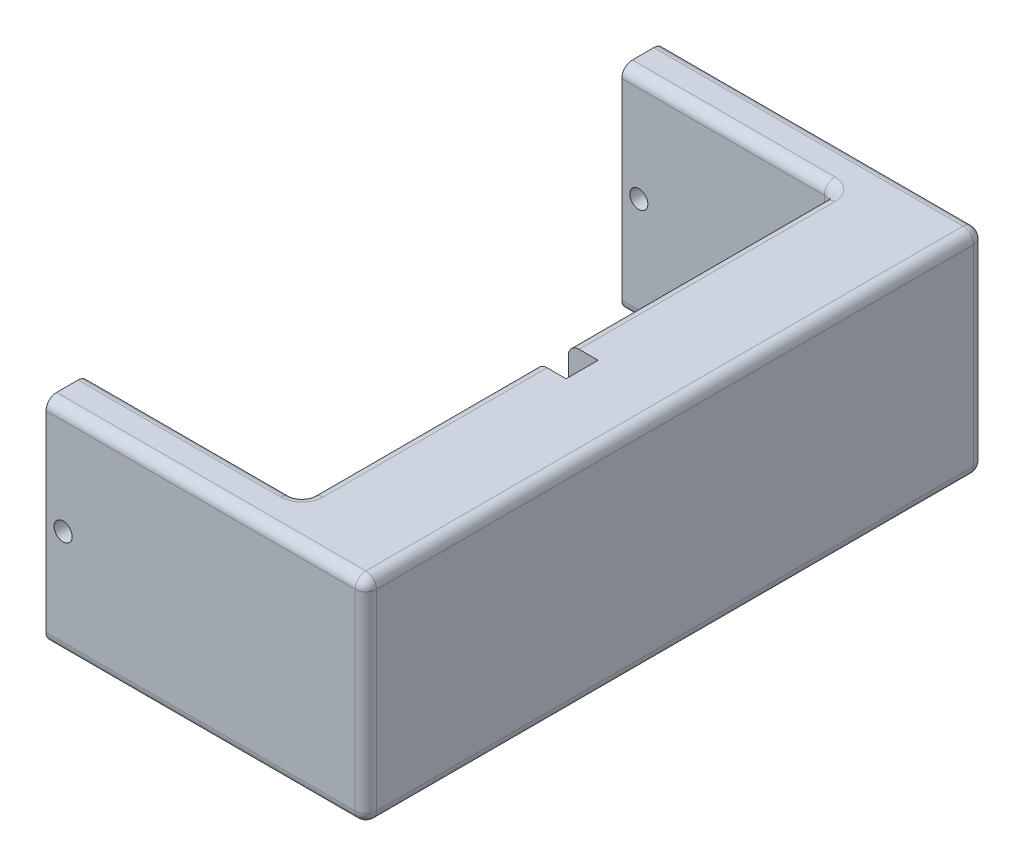
ISO-10303-21;
HEADER;
FILE_DESCRIPTION(('STEP AP214'),'2;1');
FILE_NAME('part.step','',(''),(''),'','','');
FILE_SCHEMA(('AUTOMOTIVE_DESIGN { 1 0 10303 214 1 1 1 1 }'));
ENDSEC;
DATA;
#1=APPLICATION_CONTEXT('core data for automotive mechanical design processes');
#2=APPLICATION_PROTOCOL_DEFINITION('international standard','automotive_design',2000,#1);
#3=PRODUCT_CONTEXT('',#1,'mechanical');
#4=PRODUCT('Part','Part','',(#3));
#5=PRODUCT_RELATED_PRODUCT_CATEGORY('part','',(#4));
#6=PRODUCT_DEFINITION_FORMATION('','',#4);
#7=PRODUCT_DEFINITION_CONTEXT('part definition',#1,'design');
#8=PRODUCT_DEFINITION('design','',#6,#7);
#9=PRODUCT_DEFINITION_SHAPE('','',#8);
#10=(LENGTH_UNIT() NAMED_UNIT(*) SI_UNIT(.MILLI.,.METRE.));
#11=(NAMED_UNIT(*) PLANE_ANGLE_UNIT() SI_UNIT($,.RADIAN.));
#12=(NAMED_UNIT(*) SI_UNIT($,.STERADIAN.) SOLID_ANGLE_UNIT());
#13=UNCERTAINTY_MEASURE_WITH_UNIT(LENGTH_MEASURE(1.E-05),#10,'distance_accuracy_value','');
#14=(GEOMETRIC_REPRESENTATION_CONTEXT(3) GLOBAL_UNCERTAINTY_ASSIGNED_CONTEXT((#13)) GLOBAL_UNIT_ASSIGNED_CONTEXT((#10,
#11,#12)) REPRESENTATION_CONTEXT('',''));
#15=CARTESIAN_POINT('',(0.,0.,0.));
#16=DIRECTION('',(0.,0.,1.));
#17=DIRECTION('',(1.,0.,0.));
#18=AXIS2_PLACEMENT_3D('',#15,#16,#17);
#19=CARTESIAN_POINT('',(1.05,0.95,0.));
#20=DIRECTION('',(0.,0.,-1.));
#21=DIRECTION('',(-1.,0.,0.));
#22=AXIS2_PLACEMENT_3D('',#19,#20,#21);
#23=CYLINDRICAL_SURFACE('',#22,0.05);
#24=CARTESIAN_POINT('',(1.05,0.95,0.00028488695492438));
#25=DIRECTION('',(0.,0.,-1.));
#26=DIRECTION('',(-1.,0.,0.));
#27=AXIS2_PLACEMENT_3D('',#24,#25,#26);
#28=CIRCLE('',#27,0.05);
#29=CARTESIAN_POINT('',(1.05,1.,0.00028488695492438));
#30=VERTEX_POINT('',#29);
#31=CARTESIAN_POINT('',(1.,0.95,0.000284886954924378));
#32=VERTEX_POINT('',#31);
#33=EDGE_CURVE('E54',#30,#32,#28,.F.);
#34=ORIENTED_EDGE('',*,*,#33,.F.);
#35=DIRECTION('',(0.,0.,1.));
#36=VECTOR('',#35,1.);
#37=CARTESIAN_POINT('',(1.05,1.,1.25));
#38=LINE('',#37,#36);
#39=CARTESIAN_POINT('',(1.05,1.,-1.2));
#40=VERTEX_POINT('',#39);
#41=EDGE_CURVE('E371',#40,#30,#38,.T.);
#42=ORIENTED_EDGE('',*,*,#41,.F.);
#43=CARTESIAN_POINT('',(1.05,0.95,-1.2));
#44=DIRECTION('',(0.,0.,-1.));
#45=DIRECTION('',(-1.,0.,0.));
#46=AXIS2_PLACEMENT_3D('',#43,#44,#45);
#47=CIRCLE('',#46,0.05);
#48=CARTESIAN_POINT('',(1.,0.95,-1.2));
#49=VERTEX_POINT('',#48);
#50=EDGE_CURVE('E495',#40,#49,#47,.F.);
#51=ORIENTED_EDGE('',*,*,#50,.T.);
#52=DIRECTION('',(0.,0.,1.));
#53=VECTOR('',#52,1.);
#54=CARTESIAN_POINT('',(1.,0.95,-1.25));
#55=LINE('',#54,#53);
#56=EDGE_CURVE('E435',#32,#49,#55,.F.);
#57=ORIENTED_EDGE('',*,*,#56,.F.);
#58=EDGE_LOOP('',(#34,#42,#51,#57));
#59=FACE_BOUND('',#58,.T.);
#60=ADVANCED_FACE('F45',(#59),#23,.T.);
#61=CARTESIAN_POINT('',(0.,1.,1.25));
#62=DIRECTION('',(1.,0.,0.));
#63=DIRECTION('',(0.,0.,-1.));
#64=AXIS2_PLACEMENT_3D('',#61,#62,#63);
#65=PLANE('',#64);
#66=DIRECTION('',(0.,-1.,0.));
#67=VECTOR('',#66,1.);
#68=CARTESIAN_POINT('',(0.,1.,1.25));
#69=LINE('',#68,#67);
#70=CARTESIAN_POINT('',(0.,0.95,1.25));
#71=VERTEX_POINT('',#70);
#72=CARTESIAN_POINT('',(0.,0.05,1.25));
#73=VERTEX_POINT('',#72);
#74=EDGE_CURVE('E292',#71,#73,#69,.T.);
#75=ORIENTED_EDGE('',*,*,#74,.T.);
#76=CARTESIAN_POINT('',(0.,0.05,1.3));
#77=DIRECTION('',(1.,0.,0.));
#78=DIRECTION('',(0.,0.,-1.));
#79=AXIS2_PLACEMENT_3D('',#76,#77,#78);
#80=CIRCLE('',#79,0.05);
#81=CARTESIAN_POINT('',(0.,0.,1.3));
#82=VERTEX_POINT('',#81);
#83=EDGE_CURVE('E334',#73,#82,#80,.F.);
#84=ORIENTED_EDGE('',*,*,#83,.T.);
#85=DIRECTION('',(0.,0.,1.));
#86=VECTOR('',#85,1.);
#87=CARTESIAN_POINT('',(0.,0.,1.25));
#88=LINE('',#87,#86);
#89=CARTESIAN_POINT('',(0.,0.,1.4));
#90=VERTEX_POINT('',#89);
#91=EDGE_CURVE('E293',#82,#90,#88,.T.);
#92=ORIENTED_EDGE('',*,*,#91,.T.);
#93=CARTESIAN_POINT('',(0.,0.05,1.4));
#94=DIRECTION('',(1.,0.,0.));
#95=DIRECTION('',(0.,0.,-1.));
#96=AXIS2_PLACEMENT_3D('',#93,#94,#95);
#97=CIRCLE('',#96,0.05);
#98=CARTESIAN_POINT('',(0.,0.05,1.45));
#99=VERTEX_POINT('',#98);
#100=EDGE_CURVE('E331',#90,#99,#97,.F.);
#101=ORIENTED_EDGE('',*,*,#100,.T.);
#102=DIRECTION('',(0.,-1.,0.));
#103=VECTOR('',#102,1.);
#104=CARTESIAN_POINT('',(0.,1.,1.45));
#105=LINE('',#104,#103);
#106=CARTESIAN_POINT('',(0.,0.95,1.45));
#107=VERTEX_POINT('',#106);
#108=EDGE_CURVE('E312',#107,#99,#105,.T.);
#109=ORIENTED_EDGE('',*,*,#108,.F.);
#110=CARTESIAN_POINT('',(0.,0.95,1.4));
#111=DIRECTION('',(1.,0.,0.));
#112=DIRECTION('',(0.,0.,-1.));
#113=AXIS2_PLACEMENT_3D('',#110,#111,#112);
#114=CIRCLE('',#113,0.05);
#115=CARTESIAN_POINT('',(0.,1.,1.4));
#116=VERTEX_POINT('',#115);
#117=EDGE_CURVE('E328',#107,#116,#114,.F.);
#118=ORIENTED_EDGE('',*,*,#117,.T.);
#119=DIRECTION('',(0.,0.,1.));
#120=VECTOR('',#119,1.);
#121=CARTESIAN_POINT('',(0.,1.,1.25));
#122=LINE('',#121,#120);
#123=CARTESIAN_POINT('',(0.,1.,1.3));
#124=VERTEX_POINT('',#123);
#125=EDGE_CURVE('E283',#124,#116,#122,.T.);
#126=ORIENTED_EDGE('',*,*,#125,.F.);
#127=CARTESIAN_POINT('',(0.,0.95,1.3));
#128=DIRECTION('',(1.,0.,0.));
#129=DIRECTION('',(0.,0.,-1.));
#130=AXIS2_PLACEMENT_3D('',#127,#128,#129);
#131=CIRCLE('',#130,0.05);
#132=EDGE_CURVE('E325',#124,#71,#131,.F.);
#133=ORIENTED_EDGE('',*,*,#132,.T.);
#134=EDGE_LOOP('',(#75,#84,#92,#101,#109,#118,#126,#133));
#135=FACE_BOUND('',#134,.T.);
#136=ADVANCED_FACE('F588',(#135),#65,.F.);
#137=CARTESIAN_POINT('',(0.,1.,1.45));
#138=DIRECTION('',(0.,0.,-1.));
#139=DIRECTION('',(-1.,0.,0.));
#140=AXIS2_PLACEMENT_3D('',#137,#138,#139);
#141=PLANE('',#140);
#142=CARTESIAN_POINT('',(0.08,0.5,1.45));
#143=DIRECTION('',(0.,0.,1.));
#144=DIRECTION('',(1.,0.,0.));
#145=AXIS2_PLACEMENT_3D('',#142,#143,#144);
#146=CIRCLE('',#145,0.0423352547805299);
#147=CARTESIAN_POINT('',(0.12233525478053,0.5,1.45));
#148=VERTEX_POINT('',#147);
#149=EDGE_CURVE('E269',#148,#148,#146,.T.);
#150=ORIENTED_EDGE('',*,*,#149,.F.);
#151=EDGE_LOOP('',(#150));
#152=FACE_BOUND('',#151,.T.);
#153=ORIENTED_EDGE('',*,*,#108,.T.);
#154=DIRECTION('',(1.,0.,0.));
#155=VECTOR('',#154,1.);
#156=CARTESIAN_POINT('',(0.,0.05,1.45));
#157=LINE('',#156,#155);
#158=CARTESIAN_POINT('',(1.45,0.05,1.45));
#159=VERTEX_POINT('',#158);
#160=EDGE_CURVE('E69',#99,#159,#157,.T.);
#161=ORIENTED_EDGE('',*,*,#160,.T.);
#162=DIRECTION('',(0.,-1.,0.));
#163=VECTOR('',#162,1.);
#164=CARTESIAN_POINT('',(1.45,1.,1.45));
#165=LINE('',#164,#163);
#166=CARTESIAN_POINT('',(1.45,0.95,1.45));
#167=VERTEX_POINT('',#166);
#168=EDGE_CURVE('E453',#159,#167,#165,.F.);
#169=ORIENTED_EDGE('',*,*,#168,.T.);
#170=DIRECTION('',(1.,0.,0.));
#171=VECTOR('',#170,1.);
#172=CARTESIAN_POINT('',(0.,0.95,1.45));
#173=LINE('',#172,#171);
#174=EDGE_CURVE('E450',#167,#107,#173,.F.);
#175=ORIENTED_EDGE('',*,*,#174,.T.);
#176=EDGE_LOOP('',(#153,#161,#169,#175));
#177=FACE_BOUND('',#176,.T.);
#178=ADVANCED_FACE('F704',(#152,#177),#141,.F.);
#179=CARTESIAN_POINT('',(1.5,1.,1.45));
#180=DIRECTION('',(-1.,0.,0.));
#181=DIRECTION('',(0.,0.,1.));
#182=AXIS2_PLACEMENT_3D('',#179,#180,#181);
#183=PLANE('',#182);
#184=DIRECTION('',(0.,0.,-1.));
#185=VECTOR('',#184,1.);
#186=CARTESIAN_POINT('',(1.5,0.05,1.45));
#187=LINE('',#186,#185);
#188=CARTESIAN_POINT('',(1.5,0.05,1.4));
#189=VERTEX_POINT('',#188);
#190=CARTESIAN_POINT('',(1.5,0.05,-1.4));
#191=VERTEX_POINT('',#190);
#192=EDGE_CURVE('E428',#189,#191,#187,.T.);
#193=ORIENTED_EDGE('',*,*,#192,.T.);
#194=DIRECTION('',(0.,-1.,0.));
#195=VECTOR('',#194,1.);
#196=CARTESIAN_POINT('',(1.5,1.,-1.4));
#197=LINE('',#196,#195);
#198=CARTESIAN_POINT('',(1.5,0.95,-1.4));
#199=VERTEX_POINT('',#198);
#200=EDGE_CURVE('E431',#191,#199,#197,.F.);
#201=ORIENTED_EDGE('',*,*,#200,.T.);
#202=DIRECTION('',(0.,0.,-1.));
#203=VECTOR('',#202,1.);
#204=CARTESIAN_POINT('',(1.5,0.95,1.45));
#205=LINE('',#204,#203);
#206=CARTESIAN_POINT('',(1.5,0.95,1.4));
#207=VERTEX_POINT('',#206);
#208=EDGE_CURVE('E425',#199,#207,#205,.F.);
#209=ORIENTED_EDGE('',*,*,#208,.T.);
#210=DIRECTION('',(0.,-1.,0.));
#211=VECTOR('',#210,1.);
#212=CARTESIAN_POINT('',(1.5,1.,1.4));
#213=LINE('',#212,#211);
#214=EDGE_CURVE('E422',#207,#189,#213,.T.);
#215=ORIENTED_EDGE('',*,*,#214,.T.);
#216=EDGE_LOOP('',(#193,#201,#209,#215));
#217=FACE_BOUND('',#216,.T.);
#218=ADVANCED_FACE('F722',(#217),#183,.F.);
#219=CARTESIAN_POINT('',(1.5,1.,-1.45));
#220=DIRECTION('',(0.,0.,1.));
#221=DIRECTION('',(1.,0.,0.));
#222=AXIS2_PLACEMENT_3D('',#219,#220,#221);
#223=PLANE('',#222);
#224=CARTESIAN_POINT('',(0.08,0.5,-1.45));
#225=DIRECTION('',(0.,0.,1.));
#226=DIRECTION('',(1.,0.,0.));
#227=AXIS2_PLACEMENT_3D('',#224,#225,#226);
#228=CIRCLE('',#227,0.0423352547805299);
#229=CARTESIAN_POINT('',(0.12233525478053,0.5,-1.45));
#230=VERTEX_POINT('',#229);
#231=EDGE_CURVE('E270',#230,#230,#228,.T.);
#232=ORIENTED_EDGE('',*,*,#231,.T.);
#233=EDGE_LOOP('',(#232));
#234=FACE_BOUND('',#233,.T.);
#235=DIRECTION('',(0.,-1.,0.));
#236=VECTOR('',#235,1.);
#237=CARTESIAN_POINT('',(1.45,1.,-1.45));
#238=LINE('',#237,#236);
#239=CARTESIAN_POINT('',(1.45,0.95,-1.45));
#240=VERTEX_POINT('',#239);
#241=CARTESIAN_POINT('',(1.45,0.05,-1.45));
#242=VERTEX_POINT('',#241);
#243=EDGE_CURVE('E415',#240,#242,#238,.T.);
#244=ORIENTED_EDGE('',*,*,#243,.T.);
#245=DIRECTION('',(-1.,0.,0.));
#246=VECTOR('',#245,1.);
#247=CARTESIAN_POINT('',(1.5,0.05,-1.45));
#248=LINE('',#247,#246);
#249=CARTESIAN_POINT('',(0.,0.05,-1.45));
#250=VERTEX_POINT('',#249);
#251=EDGE_CURVE('E419',#242,#250,#248,.T.);
#252=ORIENTED_EDGE('',*,*,#251,.T.);
#253=DIRECTION('',(0.,-1.,0.));
#254=VECTOR('',#253,1.);
#255=CARTESIAN_POINT('',(0.,1.,-1.45));
#256=LINE('',#255,#254);
#257=CARTESIAN_POINT('',(0.,0.95,-1.45));
#258=VERTEX_POINT('',#257);
#259=EDGE_CURVE('E308',#258,#250,#256,.T.);
#260=ORIENTED_EDGE('',*,*,#259,.F.);
#261=DIRECTION('',(-1.,0.,0.));
#262=VECTOR('',#261,1.);
#263=CARTESIAN_POINT('',(1.5,0.95,-1.45));
#264=LINE('',#263,#262);
#265=EDGE_CURVE('E412',#258,#240,#264,.F.);
#266=ORIENTED_EDGE('',*,*,#265,.T.);
#267=EDGE_LOOP('',(#244,#252,#260,#266));
#268=FACE_BOUND('',#267,.T.);
#269=ADVANCED_FACE('F618',(#234,#268),#223,.F.);
#270=CARTESIAN_POINT('',(0.,1.,-1.45));
#271=DIRECTION('',(1.,0.,0.));
#272=DIRECTION('',(0.,0.,-1.));
#273=AXIS2_PLACEMENT_3D('',#270,#271,#272);
#274=PLANE('',#273);
#275=DIRECTION('',(0.,-1.,0.));
#276=VECTOR('',#275,1.);
#277=CARTESIAN_POINT('',(0.,1.,-1.25));
#278=LINE('',#277,#276);
#279=CARTESIAN_POINT('',(0.,0.95,-1.25));
#280=VERTEX_POINT('',#279);
#281=CARTESIAN_POINT('',(0.,0.05,-1.25));
#282=VERTEX_POINT('',#281);
#283=EDGE_CURVE('E304',#280,#282,#278,.T.);
#284=ORIENTED_EDGE('',*,*,#283,.F.);
#285=CARTESIAN_POINT('',(0.,0.95,-1.3));
#286=DIRECTION('',(1.,0.,0.));
#287=DIRECTION('',(0.,0.,-1.));
#288=AXIS2_PLACEMENT_3D('',#285,#286,#287);
#289=CIRCLE('',#288,0.05);
#290=CARTESIAN_POINT('',(0.,1.,-1.3));
#291=VERTEX_POINT('',#290);
#292=EDGE_CURVE('E409',#280,#291,#289,.F.);
#293=ORIENTED_EDGE('',*,*,#292,.T.);
#294=DIRECTION('',(0.,0.,1.));
#295=VECTOR('',#294,1.);
#296=CARTESIAN_POINT('',(0.,1.,-1.45));
#297=LINE('',#296,#295);
#298=CARTESIAN_POINT('',(0.,1.,-1.4));
#299=VERTEX_POINT('',#298);
#300=EDGE_CURVE('E287',#299,#291,#297,.T.);
#301=ORIENTED_EDGE('',*,*,#300,.F.);
#302=CARTESIAN_POINT('',(0.,0.95,-1.4));
#303=DIRECTION('',(1.,0.,0.));
#304=DIRECTION('',(0.,0.,-1.));
#305=AXIS2_PLACEMENT_3D('',#302,#303,#304);
#306=CIRCLE('',#305,0.05);
#307=EDGE_CURVE('E400',#299,#258,#306,.F.);
#308=ORIENTED_EDGE('',*,*,#307,.T.);
#309=ORIENTED_EDGE('',*,*,#259,.T.);
#310=CARTESIAN_POINT('',(0.,0.05,-1.4));
#311=DIRECTION('',(1.,0.,0.));
#312=DIRECTION('',(0.,0.,-1.));
#313=AXIS2_PLACEMENT_3D('',#310,#311,#312);
#314=CIRCLE('',#313,0.05);
#315=CARTESIAN_POINT('',(0.,0.,-1.4));
#316=VERTEX_POINT('',#315);
#317=EDGE_CURVE('E403',#250,#316,#314,.F.);
#318=ORIENTED_EDGE('',*,*,#317,.T.);
#319=DIRECTION('',(0.,0.,1.));
#320=VECTOR('',#319,1.);
#321=CARTESIAN_POINT('',(0.,0.,-1.45));
#322=LINE('',#321,#320);
#323=CARTESIAN_POINT('',(0.,0.,-1.3));
#324=VERTEX_POINT('',#323);
#325=EDGE_CURVE('E288',#316,#324,#322,.T.);
#326=ORIENTED_EDGE('',*,*,#325,.T.);
#327=CARTESIAN_POINT('',(0.,0.05,-1.3));
#328=DIRECTION('',(1.,0.,0.));
#329=DIRECTION('',(0.,0.,-1.));
#330=AXIS2_PLACEMENT_3D('',#327,#328,#329);
#331=CIRCLE('',#330,0.05);
#332=EDGE_CURVE('E406',#324,#282,#331,.F.);
#333=ORIENTED_EDGE('',*,*,#332,.T.);
#334=EDGE_LOOP('',(#284,#293,#301,#308,#309,#318,#326,#333));
#335=FACE_BOUND('',#334,.T.);
#336=ADVANCED_FACE('F624',(#335),#274,.F.);
#337=CARTESIAN_POINT('',(0.,1.,-1.25));
#338=DIRECTION('',(0.,0.,-1.));
#339=DIRECTION('',(-1.,0.,0.));
#340=AXIS2_PLACEMENT_3D('',#337,#338,#339);
#341=PLANE('',#340);
#342=CARTESIAN_POINT('',(0.08,0.5,-1.25));
#343=DIRECTION('',(0.,0.,-1.));
#344=DIRECTION('',(-1.,0.,0.));
#345=AXIS2_PLACEMENT_3D('',#342,#343,#344);
#346=CIRCLE('',#345,0.0423352547805299);
#347=CARTESIAN_POINT('',(0.0376647452194702,0.5,-1.25));
#348=VERTEX_POINT('',#347);
#349=EDGE_CURVE('E278',#348,#348,#346,.T.);
#350=ORIENTED_EDGE('',*,*,#349,.T.);
#351=EDGE_LOOP('',(#350));
#352=FACE_BOUND('',#351,.T.);
#353=DIRECTION('',(0.,-1.,0.));
#354=VECTOR('',#353,1.);
#355=CARTESIAN_POINT('',(0.95,1.,-1.25));
#356=LINE('',#355,#354);
#357=CARTESIAN_POINT('',(0.95,0.05,-1.25));
#358=VERTEX_POINT('',#357);
#359=CARTESIAN_POINT('',(0.95,0.95,-1.25));
#360=VERTEX_POINT('',#359);
#361=EDGE_CURVE('E391',#358,#360,#356,.F.);
#362=ORIENTED_EDGE('',*,*,#361,.T.);
#363=DIRECTION('',(1.,0.,0.));
#364=VECTOR('',#363,1.);
#365=CARTESIAN_POINT('',(0.,0.95,-1.25));
#366=LINE('',#365,#364);
#367=EDGE_CURVE('E397',#360,#280,#366,.F.);
#368=ORIENTED_EDGE('',*,*,#367,.T.);
#369=ORIENTED_EDGE('',*,*,#283,.T.);
#370=DIRECTION('',(1.,0.,0.));
#371=VECTOR('',#370,1.);
#372=CARTESIAN_POINT('',(0.,0.05,-1.25));
#373=LINE('',#372,#371);
#374=EDGE_CURVE('E394',#282,#358,#373,.T.);
#375=ORIENTED_EDGE('',*,*,#374,.T.);
#376=EDGE_LOOP('',(#362,#368,#369,#375));
#377=FACE_BOUND('',#376,.T.);
#378=ADVANCED_FACE('F677',(#352,#377),#341,.F.);
#379=CARTESIAN_POINT('',(1.,1.,-1.25));
#380=DIRECTION('',(1.,0.,0.));
#381=DIRECTION('',(0.,0.,-1.));
#382=AXIS2_PLACEMENT_3D('',#379,#380,#381);
#383=PLANE('',#382);
#384=DIRECTION('',(0.,0.,-1.));
#385=VECTOR('',#384,1.);
#386=CARTESIAN_POINT('',(1.,0.8,-1.25));
#387=LINE('',#386,#385);
#388=CARTESIAN_POINT('',(1.,0.8,0.150284886954924));
#389=VERTEX_POINT('',#388);
#390=CARTESIAN_POINT('',(1.,0.8,0.000284886954924378));
#391=VERTEX_POINT('',#390);
#392=EDGE_CURVE('E11',#389,#391,#387,.T.);
#393=ORIENTED_EDGE('',*,*,#392,.T.);
#394=DIRECTION('',(0.,1.,0.));
#395=VECTOR('',#394,1.);
#396=CARTESIAN_POINT('',(1.,1.,0.000284886954924355));
#397=LINE('',#396,#395);
#398=EDGE_CURVE('E265',#391,#32,#397,.T.);
#399=ORIENTED_EDGE('',*,*,#398,.T.);
#400=ORIENTED_EDGE('',*,*,#56,.T.);
#401=DIRECTION('',(0.,-1.,0.));
#402=VECTOR('',#401,1.);
#403=CARTESIAN_POINT('',(1.,0.,-1.2));
#404=LINE('',#403,#402);
#405=CARTESIAN_POINT('',(1.,0.05,-1.2));
#406=VERTEX_POINT('',#405);
#407=EDGE_CURVE('E440',#49,#406,#404,.T.);
#408=ORIENTED_EDGE('',*,*,#407,.T.);
#409=DIRECTION('',(0.,0.,1.));
#410=VECTOR('',#409,1.);
#411=CARTESIAN_POINT('',(1.,0.05,-1.25));
#412=LINE('',#411,#410);
#413=CARTESIAN_POINT('',(1.,0.05,1.2));
#414=VERTEX_POINT('',#413);
#415=EDGE_CURVE('E447',#406,#414,#412,.T.);
#416=ORIENTED_EDGE('',*,*,#415,.T.);
#417=DIRECTION('',(0.,-1.,0.));
#418=VECTOR('',#417,1.);
#419=CARTESIAN_POINT('',(1.,1.,1.2));
#420=LINE('',#419,#418);
#421=CARTESIAN_POINT('',(1.,0.95,1.2));
#422=VERTEX_POINT('',#421);
#423=EDGE_CURVE('E443',#414,#422,#420,.F.);
#424=ORIENTED_EDGE('',*,*,#423,.T.);
#425=CARTESIAN_POINT('',(1.,0.95,0.150284886954924));
#426=VERTEX_POINT('',#425);
#427=EDGE_CURVE('E436',#422,#426,#55,.F.);
#428=ORIENTED_EDGE('',*,*,#427,.T.);
#429=DIRECTION('',(0.,-1.,0.));
#430=VECTOR('',#429,1.);
#431=CARTESIAN_POINT('',(1.,1.,0.150284886954924));
#432=LINE('',#431,#430);
#433=EDGE_CURVE('E61',#426,#389,#432,.T.);
#434=ORIENTED_EDGE('',*,*,#433,.T.);
#435=EDGE_LOOP('',(#393,#399,#400,#408,#416,#424,#428,#434));
#436=FACE_BOUND('',#435,.T.);
#437=ADVANCED_FACE('F563',(#436),#383,.F.);
#438=CARTESIAN_POINT('',(1.,1.,1.25));
#439=DIRECTION('',(0.,0.,1.));
#440=DIRECTION('',(1.,0.,0.));
#441=AXIS2_PLACEMENT_3D('',#438,#439,#440);
#442=PLANE('',#441);
#443=CARTESIAN_POINT('',(0.08,0.5,1.25));
#444=DIRECTION('',(0.,0.,1.));
#445=DIRECTION('',(1.,0.,0.));
#446=AXIS2_PLACEMENT_3D('',#443,#444,#445);
#447=CIRCLE('',#446,0.0423352547805299);
#448=CARTESIAN_POINT('',(0.12233525478053,0.5,1.25));
#449=VERTEX_POINT('',#448);
#450=EDGE_CURVE('E274',#449,#449,#447,.T.);
#451=ORIENTED_EDGE('',*,*,#450,.T.);
#452=EDGE_LOOP('',(#451));
#453=FACE_BOUND('',#452,.T.);
#454=DIRECTION('',(0.,-1.,0.));
#455=VECTOR('',#454,1.);
#456=CARTESIAN_POINT('',(0.95,0.,1.25));
#457=LINE('',#456,#455);
#458=CARTESIAN_POINT('',(0.95,0.95,1.25));
#459=VERTEX_POINT('',#458);
#460=CARTESIAN_POINT('',(0.95,0.05,1.25));
#461=VERTEX_POINT('',#460);
#462=EDGE_CURVE('E318',#459,#461,#457,.T.);
#463=ORIENTED_EDGE('',*,*,#462,.T.);
#464=DIRECTION('',(-1.,0.,0.));
#465=VECTOR('',#464,1.);
#466=CARTESIAN_POINT('',(1.,0.05,1.25));
#467=LINE('',#466,#465);
#468=EDGE_CURVE('E321',#461,#73,#467,.T.);
#469=ORIENTED_EDGE('',*,*,#468,.T.);
#470=ORIENTED_EDGE('',*,*,#74,.F.);
#471=DIRECTION('',(-1.,0.,0.));
#472=VECTOR('',#471,1.);
#473=CARTESIAN_POINT('',(1.,0.95,1.25));
#474=LINE('',#473,#472);
#475=EDGE_CURVE('E315',#71,#459,#474,.F.);
#476=ORIENTED_EDGE('',*,*,#475,.T.);
#477=EDGE_LOOP('',(#463,#469,#470,#476));
#478=FACE_BOUND('',#477,.T.);
#479=ADVANCED_FACE('F652',(#453,#478),#442,.F.);
#480=CARTESIAN_POINT('',(0.,1.,0.));
#481=DIRECTION('',(0.,1.,0.));
#482=DIRECTION('',(0.,0.,1.));
#483=AXIS2_PLACEMENT_3D('',#480,#481,#482);
#484=PLANE('',#483);
#485=DIRECTION('',(-1.,0.,0.));
#486=VECTOR('',#485,1.);
#487=CARTESIAN_POINT('',(0.908521856142397,1.,0.000284886954924376));
#488=LINE('',#487,#486);
#489=CARTESIAN_POINT('',(1.13921545526778,1.,0.000284886954924382));
#490=VERTEX_POINT('',#489);
#491=EDGE_CURVE('E234',#490,#30,#488,.T.);
#492=ORIENTED_EDGE('',*,*,#491,.F.);
#493=DIRECTION('',(0.,0.,-1.));
#494=VECTOR('',#493,1.);
#495=CARTESIAN_POINT('',(1.13921545526778,1.,0.000284886954924382));
#496=LINE('',#495,#494);
#497=CARTESIAN_POINT('',(1.13921545526778,1.,0.150284886954924));
#498=VERTEX_POINT('',#497);
#499=EDGE_CURVE('E256',#498,#490,#496,.T.);
#500=ORIENTED_EDGE('',*,*,#499,.F.);
#501=DIRECTION('',(1.,0.,0.));
#502=VECTOR('',#501,1.);
#503=CARTESIAN_POINT('',(0.908521856142397,1.,0.150284886954924));
#504=LINE('',#503,#502);
#505=CARTESIAN_POINT('',(1.05,1.,0.150284886954924));
#506=VERTEX_POINT('',#505);
#507=EDGE_CURVE('E240',#506,#498,#504,.T.);
#508=ORIENTED_EDGE('',*,*,#507,.F.);
#509=CARTESIAN_POINT('',(1.05,1.,1.2));
#510=VERTEX_POINT('',#509);
#511=EDGE_CURVE('E370',#506,#510,#38,.T.);
#512=ORIENTED_EDGE('',*,*,#511,.T.);
#513=CARTESIAN_POINT('',(0.95,1.,1.2));
#514=DIRECTION('',(0.,1.,0.));
#515=DIRECTION('',(0.,0.,1.));
#516=AXIS2_PLACEMENT_3D('',#513,#514,#515);
#517=CIRCLE('',#516,0.1);
#518=CARTESIAN_POINT('',(0.95,1.,1.3));
#519=VERTEX_POINT('',#518);
#520=EDGE_CURVE('E366',#519,#510,#517,.T.);
#521=ORIENTED_EDGE('',*,*,#520,.F.);
#522=DIRECTION('',(-1.,0.,0.));
#523=VECTOR('',#522,1.);
#524=CARTESIAN_POINT('',(0.,1.,1.3));
#525=LINE('',#524,#523);
#526=EDGE_CURVE('E363',#519,#124,#525,.T.);
#527=ORIENTED_EDGE('',*,*,#526,.T.);
#528=ORIENTED_EDGE('',*,*,#125,.T.);
#529=DIRECTION('',(1.,0.,0.));
#530=VECTOR('',#529,1.);
#531=CARTESIAN_POINT('',(1.5,1.,1.4));
#532=LINE('',#531,#530);
#533=CARTESIAN_POINT('',(1.45,1.,1.4));
#534=VERTEX_POINT('',#533);
#535=EDGE_CURVE('E382',#116,#534,#532,.T.);
#536=ORIENTED_EDGE('',*,*,#535,.T.);
#537=DIRECTION('',(0.,0.,-1.));
#538=VECTOR('',#537,1.);
#539=CARTESIAN_POINT('',(1.45,1.,-1.45));
#540=LINE('',#539,#538);
#541=CARTESIAN_POINT('',(1.45,1.,-1.4));
#542=VERTEX_POINT('',#541);
#543=EDGE_CURVE('E385',#534,#542,#540,.T.);
#544=ORIENTED_EDGE('',*,*,#543,.T.);
#545=DIRECTION('',(-1.,0.,0.));
#546=VECTOR('',#545,1.);
#547=CARTESIAN_POINT('',(0.,1.,-1.4));
#548=LINE('',#547,#546);
#549=EDGE_CURVE('E388',#542,#299,#548,.T.);
#550=ORIENTED_EDGE('',*,*,#549,.T.);
#551=ORIENTED_EDGE('',*,*,#300,.T.);
#552=DIRECTION('',(1.,0.,0.));
#553=VECTOR('',#552,1.);
#554=CARTESIAN_POINT('',(1.,1.,-1.3));
#555=LINE('',#554,#553);
#556=CARTESIAN_POINT('',(0.95,1.,-1.3));
#557=VERTEX_POINT('',#556);
#558=EDGE_CURVE('E379',#291,#557,#555,.T.);
#559=ORIENTED_EDGE('',*,*,#558,.T.);
#560=CARTESIAN_POINT('',(0.95,1.,-1.2));
#561=DIRECTION('',(0.,1.,0.));
#562=DIRECTION('',(0.,0.,1.));
#563=AXIS2_PLACEMENT_3D('',#560,#561,#562);
#564=CIRCLE('',#563,0.1);
#565=EDGE_CURVE('E375',#40,#557,#564,.T.);
#566=ORIENTED_EDGE('',*,*,#565,.F.);
#567=ORIENTED_EDGE('',*,*,#41,.T.);
#568=EDGE_LOOP('',(#492,#500,#508,#512,#521,#527,#528,#536,#544,#550,#551,#559,#566,#567));
#569=FACE_BOUND('',#568,.T.);
#570=ADVANCED_FACE('F571',(#569),#484,.T.);
#571=CARTESIAN_POINT('',(0.,0.,0.));
#572=DIRECTION('',(0.,1.,0.));
#573=DIRECTION('',(0.,0.,1.));
#574=AXIS2_PLACEMENT_3D('',#571,#572,#573);
#575=PLANE('',#574);
#576=ORIENTED_EDGE('',*,*,#91,.F.);
#577=DIRECTION('',(-1.,0.,0.));
#578=VECTOR('',#577,1.);
#579=CARTESIAN_POINT('',(0.,0.,1.3));
#580=LINE('',#579,#578);
#581=CARTESIAN_POINT('',(0.95,0.,1.3));
#582=VERTEX_POINT('',#581);
#583=EDGE_CURVE('E360',#82,#582,#580,.F.);
#584=ORIENTED_EDGE('',*,*,#583,.T.);
#585=CARTESIAN_POINT('',(0.95,0.,1.2));
#586=DIRECTION('',(0.,1.,0.));
#587=DIRECTION('',(0.,0.,1.));
#588=AXIS2_PLACEMENT_3D('',#585,#586,#587);
#589=CIRCLE('',#588,0.1);
#590=CARTESIAN_POINT('',(1.05,0.,1.2));
#591=VERTEX_POINT('',#590);
#592=EDGE_CURVE('E356',#591,#582,#589,.F.);
#593=ORIENTED_EDGE('',*,*,#592,.F.);
#594=DIRECTION('',(0.,0.,1.));
#595=VECTOR('',#594,1.);
#596=CARTESIAN_POINT('',(1.05,0.,0.));
#597=LINE('',#596,#595);
#598=CARTESIAN_POINT('',(1.05,0.,-1.2));
#599=VERTEX_POINT('',#598);
#600=EDGE_CURVE('E350',#591,#599,#597,.F.);
#601=ORIENTED_EDGE('',*,*,#600,.T.);
#602=CARTESIAN_POINT('',(0.95,0.,-1.2));
#603=DIRECTION('',(0.,1.,0.));
#604=DIRECTION('',(0.,0.,1.));
#605=AXIS2_PLACEMENT_3D('',#602,#603,#604);
#606=CIRCLE('',#605,0.1);
#607=CARTESIAN_POINT('',(0.95,0.,-1.3));
#608=VERTEX_POINT('',#607);
#609=EDGE_CURVE('E346',#608,#599,#606,.F.);
#610=ORIENTED_EDGE('',*,*,#609,.F.);
#611=DIRECTION('',(1.,0.,0.));
#612=VECTOR('',#611,1.);
#613=CARTESIAN_POINT('',(0.,0.,-1.3));
#614=LINE('',#613,#612);
#615=EDGE_CURVE('E353',#608,#324,#614,.F.);
#616=ORIENTED_EDGE('',*,*,#615,.T.);
#617=ORIENTED_EDGE('',*,*,#325,.F.);
#618=DIRECTION('',(-1.,0.,0.));
#619=VECTOR('',#618,1.);
#620=CARTESIAN_POINT('',(0.,0.,-1.4));
#621=LINE('',#620,#619);
#622=CARTESIAN_POINT('',(1.45,0.,-1.4));
#623=VERTEX_POINT('',#622);
#624=EDGE_CURVE('E343',#316,#623,#621,.F.);
#625=ORIENTED_EDGE('',*,*,#624,.T.);
#626=DIRECTION('',(0.,0.,-1.));
#627=VECTOR('',#626,1.);
#628=CARTESIAN_POINT('',(1.45,0.,0.));
#629=LINE('',#628,#627);
#630=CARTESIAN_POINT('',(1.45,0.,1.4));
#631=VERTEX_POINT('',#630);
#632=EDGE_CURVE('E340',#623,#631,#629,.F.);
#633=ORIENTED_EDGE('',*,*,#632,.T.);
#634=DIRECTION('',(1.,0.,0.));
#635=VECTOR('',#634,1.);
#636=CARTESIAN_POINT('',(0.,0.,1.4));
#637=LINE('',#636,#635);
#638=EDGE_CURVE('E337',#631,#90,#637,.F.);
#639=ORIENTED_EDGE('',*,*,#638,.T.);
#640=EDGE_LOOP('',(#576,#584,#593,#601,#610,#616,#617,#625,#633,#639));
#641=FACE_BOUND('',#640,.T.);
#642=ADVANCED_FACE('F633',(#641),#575,.F.);
#643=CARTESIAN_POINT('',(0.,0.95,-1.3));
#644=DIRECTION('',(-1.,0.,0.));
#645=DIRECTION('',(0.,0.,1.));
#646=AXIS2_PLACEMENT_3D('',#643,#644,#645);
#647=CYLINDRICAL_SURFACE('',#646,0.05);
#648=CARTESIAN_POINT('',(0.95,0.95,-1.3));
#649=DIRECTION('',(1.,0.,0.));
#650=DIRECTION('',(0.,0.,-1.));
#651=AXIS2_PLACEMENT_3D('',#648,#649,#650);
#652=CIRCLE('',#651,0.05);
#653=EDGE_CURVE('E297',#557,#360,#652,.T.);
#654=ORIENTED_EDGE('',*,*,#653,.F.);
#655=ORIENTED_EDGE('',*,*,#558,.F.);
#656=ORIENTED_EDGE('',*,*,#292,.F.);
#657=ORIENTED_EDGE('',*,*,#367,.F.);
#658=EDGE_LOOP('',(#654,#655,#656,#657));
#659=FACE_BOUND('',#658,.T.);
#660=ADVANCED_FACE('F682',(#659),#647,.T.);
#661=CARTESIAN_POINT('',(0.95,0.95,-1.2));
#662=DIRECTION('',(0.,1.,0.));
#663=DIRECTION('',(0.,0.,1.));
#664=AXIS2_PLACEMENT_3D('',#661,#662,#663);
#665=TOROIDAL_SURFACE('',#664,0.1,0.05);
#666=ORIENTED_EDGE('',*,*,#565,.T.);
#667=ORIENTED_EDGE('',*,*,#653,.T.);
#668=CARTESIAN_POINT('',(0.95,0.95,-1.2));
#669=DIRECTION('',(0.,1.,0.));
#670=DIRECTION('',(0.,0.,1.));
#671=AXIS2_PLACEMENT_3D('',#668,#669,#670);
#672=CIRCLE('',#671,0.05);
#673=EDGE_CURVE('E499',#49,#360,#672,.T.);
#674=ORIENTED_EDGE('',*,*,#673,.F.);
#675=ORIENTED_EDGE('',*,*,#50,.F.);
#676=EDGE_LOOP('',(#666,#667,#674,#675));
#677=FACE_BOUND('',#676,.T.);
#678=ADVANCED_FACE('F685',(#677),#665,.T.);
#679=CARTESIAN_POINT('',(0.,0.05,-1.3));
#680=DIRECTION('',(1.,0.,0.));
#681=DIRECTION('',(0.,0.,-1.));
#682=AXIS2_PLACEMENT_3D('',#679,#680,#681);
#683=CYLINDRICAL_SURFACE('',#682,0.05);
#684=ORIENTED_EDGE('',*,*,#332,.F.);
#685=ORIENTED_EDGE('',*,*,#615,.F.);
#686=CARTESIAN_POINT('',(0.95,0.05,-1.3));
#687=DIRECTION('',(1.,0.,0.));
#688=DIRECTION('',(0.,0.,-1.));
#689=AXIS2_PLACEMENT_3D('',#686,#687,#688);
#690=CIRCLE('',#689,0.05);
#691=EDGE_CURVE('E491',#358,#608,#690,.T.);
#692=ORIENTED_EDGE('',*,*,#691,.F.);
#693=ORIENTED_EDGE('',*,*,#374,.F.);
#694=EDGE_LOOP('',(#684,#685,#692,#693));
#695=FACE_BOUND('',#694,.T.);
#696=ADVANCED_FACE('F673',(#695),#683,.T.);
#697=CARTESIAN_POINT('',(0.95,1.,-1.2));
#698=DIRECTION('',(0.,1.,0.));
#699=DIRECTION('',(0.,0.,1.));
#700=AXIS2_PLACEMENT_3D('',#697,#698,#699);
#701=CYLINDRICAL_SURFACE('',#700,0.05);
#702=ORIENTED_EDGE('',*,*,#673,.T.);
#703=ORIENTED_EDGE('',*,*,#361,.F.);
#704=CARTESIAN_POINT('',(0.95,0.05,-1.2));
#705=DIRECTION('',(0.,1.,0.));
#706=DIRECTION('',(0.,0.,1.));
#707=AXIS2_PLACEMENT_3D('',#704,#705,#706);
#708=CIRCLE('',#707,0.05);
#709=EDGE_CURVE('E487',#406,#358,#708,.T.);
#710=ORIENTED_EDGE('',*,*,#709,.F.);
#711=ORIENTED_EDGE('',*,*,#407,.F.);
#712=EDGE_LOOP('',(#702,#703,#710,#711));
#713=FACE_BOUND('',#712,.T.);
#714=ADVANCED_FACE('F688',(#713),#701,.F.);
#715=CARTESIAN_POINT('',(1.05,0.95,0.150284886954924));
#716=DIRECTION('',(0.,0.,1.));
#717=DIRECTION('',(1.,0.,0.));
#718=AXIS2_PLACEMENT_3D('',#715,#716,#717);
#719=CIRCLE('',#718,0.05);
#720=EDGE_CURVE('E458',#426,#506,#719,.F.);
#721=ORIENTED_EDGE('',*,*,#720,.F.);
#722=ORIENTED_EDGE('',*,*,#427,.F.);
#723=CARTESIAN_POINT('',(1.05,0.95,1.2));
#724=DIRECTION('',(0.,0.,1.));
#725=DIRECTION('',(1.,0.,0.));
#726=AXIS2_PLACEMENT_3D('',#723,#724,#725);
#727=CIRCLE('',#726,0.05);
#728=EDGE_CURVE('E483',#510,#422,#727,.T.);
#729=ORIENTED_EDGE('',*,*,#728,.F.);
#730=ORIENTED_EDGE('',*,*,#511,.F.);
#731=EDGE_LOOP('',(#721,#722,#729,#730));
#732=FACE_BOUND('',#731,.T.);
#733=ADVANCED_FACE('F575',(#732),#23,.T.);
#734=CARTESIAN_POINT('',(0.,0.95,1.3));
#735=DIRECTION('',(1.,0.,0.));
#736=DIRECTION('',(0.,0.,-1.));
#737=AXIS2_PLACEMENT_3D('',#734,#735,#736);
#738=CYLINDRICAL_SURFACE('',#737,0.05);
#739=ORIENTED_EDGE('',*,*,#132,.F.);
#740=ORIENTED_EDGE('',*,*,#526,.F.);
#741=CARTESIAN_POINT('',(0.95,0.95,1.3));
#742=DIRECTION('',(1.,0.,0.));
#743=DIRECTION('',(0.,0.,-1.));
#744=AXIS2_PLACEMENT_3D('',#741,#742,#743);
#745=CIRCLE('',#744,0.05);
#746=EDGE_CURVE('E479',#459,#519,#745,.T.);
#747=ORIENTED_EDGE('',*,*,#746,.F.);
#748=ORIENTED_EDGE('',*,*,#475,.F.);
#749=EDGE_LOOP('',(#739,#740,#747,#748));
#750=FACE_BOUND('',#749,.T.);
#751=ADVANCED_FACE('F584',(#750),#738,.T.);
#752=CARTESIAN_POINT('',(0.95,0.05,-1.2));
#753=DIRECTION('',(0.,1.,0.));
#754=DIRECTION('',(0.,0.,1.));
#755=AXIS2_PLACEMENT_3D('',#752,#753,#754);
#756=TOROIDAL_SURFACE('',#755,0.1,0.05);
#757=ORIENTED_EDGE('',*,*,#691,.T.);
#758=ORIENTED_EDGE('',*,*,#609,.T.);
#759=CARTESIAN_POINT('',(1.05,0.05,-1.2));
#760=DIRECTION('',(0.,0.,-1.));
#761=DIRECTION('',(-1.,0.,0.));
#762=AXIS2_PLACEMENT_3D('',#759,#760,#761);
#763=CIRCLE('',#762,0.05);
#764=EDGE_CURVE('E475',#406,#599,#763,.F.);
#765=ORIENTED_EDGE('',*,*,#764,.F.);
#766=ORIENTED_EDGE('',*,*,#709,.T.);
#767=EDGE_LOOP('',(#757,#758,#765,#766));
#768=FACE_BOUND('',#767,.T.);
#769=ADVANCED_FACE('F667',(#768),#756,.T.);
#770=CARTESIAN_POINT('',(0.95,0.95,1.2));
#771=DIRECTION('',(0.,1.,0.));
#772=DIRECTION('',(0.,0.,1.));
#773=AXIS2_PLACEMENT_3D('',#770,#771,#772);
#774=TOROIDAL_SURFACE('',#773,0.1,0.05);
#775=ORIENTED_EDGE('',*,*,#520,.T.);
#776=ORIENTED_EDGE('',*,*,#728,.T.);
#777=CARTESIAN_POINT('',(0.95,0.95,1.2));
#778=DIRECTION('',(0.,1.,0.));
#779=DIRECTION('',(0.,0.,1.));
#780=AXIS2_PLACEMENT_3D('',#777,#778,#779);
#781=CIRCLE('',#780,0.05);
#782=EDGE_CURVE('E472',#459,#422,#781,.T.);
#783=ORIENTED_EDGE('',*,*,#782,.F.);
#784=ORIENTED_EDGE('',*,*,#746,.T.);
#785=EDGE_LOOP('',(#775,#776,#783,#784));
#786=FACE_BOUND('',#785,.T.);
#787=ADVANCED_FACE('F578',(#786),#774,.T.);
#788=CARTESIAN_POINT('',(1.05,0.05,-1.25));
#789=DIRECTION('',(0.,0.,1.));
#790=DIRECTION('',(1.,0.,0.));
#791=AXIS2_PLACEMENT_3D('',#788,#789,#790);
#792=CYLINDRICAL_SURFACE('',#791,0.05);
#793=ORIENTED_EDGE('',*,*,#764,.T.);
#794=ORIENTED_EDGE('',*,*,#600,.F.);
#795=CARTESIAN_POINT('',(1.05,0.05,1.2));
#796=DIRECTION('',(0.,0.,1.));
#797=DIRECTION('',(1.,0.,0.));
#798=AXIS2_PLACEMENT_3D('',#795,#796,#797);
#799=CIRCLE('',#798,0.05);
#800=EDGE_CURVE('E468',#414,#591,#799,.T.);
#801=ORIENTED_EDGE('',*,*,#800,.F.);
#802=ORIENTED_EDGE('',*,*,#415,.F.);
#803=EDGE_LOOP('',(#793,#794,#801,#802));
#804=FACE_BOUND('',#803,.T.);
#805=ADVANCED_FACE('F663',(#804),#792,.T.);
#806=CARTESIAN_POINT('',(0.95,1.,1.2));
#807=DIRECTION('',(0.,1.,0.));
#808=DIRECTION('',(0.,0.,1.));
#809=AXIS2_PLACEMENT_3D('',#806,#807,#808);
#810=CYLINDRICAL_SURFACE('',#809,0.05);
#811=ORIENTED_EDGE('',*,*,#782,.T.);
#812=ORIENTED_EDGE('',*,*,#423,.F.);
#813=CARTESIAN_POINT('',(0.95,0.05,1.2));
#814=DIRECTION('',(0.,1.,0.));
#815=DIRECTION('',(0.,0.,1.));
#816=AXIS2_PLACEMENT_3D('',#813,#814,#815);
#817=CIRCLE('',#816,0.05);
#818=EDGE_CURVE('E463',#461,#414,#817,.T.);
#819=ORIENTED_EDGE('',*,*,#818,.F.);
#820=ORIENTED_EDGE('',*,*,#462,.F.);
#821=EDGE_LOOP('',(#811,#812,#819,#820));
#822=FACE_BOUND('',#821,.T.);
#823=ADVANCED_FACE('F657',(#822),#810,.F.);
#824=CARTESIAN_POINT('',(0.95,0.05,1.2));
#825=DIRECTION('',(0.,1.,0.));
#826=DIRECTION('',(0.,0.,1.));
#827=AXIS2_PLACEMENT_3D('',#824,#825,#826);
#828=TOROIDAL_SURFACE('',#827,0.1,0.05);
#829=ORIENTED_EDGE('',*,*,#800,.T.);
#830=ORIENTED_EDGE('',*,*,#592,.T.);
#831=CARTESIAN_POINT('',(0.95,0.05,1.3));
#832=DIRECTION('',(1.,0.,0.));
#833=DIRECTION('',(0.,0.,-1.));
#834=AXIS2_PLACEMENT_3D('',#831,#832,#833);
#835=CIRCLE('',#834,0.05);
#836=EDGE_CURVE('E459',#461,#582,#835,.F.);
#837=ORIENTED_EDGE('',*,*,#836,.F.);
#838=ORIENTED_EDGE('',*,*,#818,.T.);
#839=EDGE_LOOP('',(#829,#830,#837,#838));
#840=FACE_BOUND('',#839,.T.);
#841=ADVANCED_FACE('F660',(#840),#828,.T.);
#842=CARTESIAN_POINT('',(1.,0.05,1.3));
#843=DIRECTION('',(-1.,0.,0.));
#844=DIRECTION('',(0.,0.,1.));
#845=AXIS2_PLACEMENT_3D('',#842,#843,#844);
#846=CYLINDRICAL_SURFACE('',#845,0.05);
#847=ORIENTED_EDGE('',*,*,#836,.T.);
#848=ORIENTED_EDGE('',*,*,#583,.F.);
#849=ORIENTED_EDGE('',*,*,#83,.F.);
#850=ORIENTED_EDGE('',*,*,#468,.F.);
#851=EDGE_LOOP('',(#847,#848,#849,#850));
#852=FACE_BOUND('',#851,.T.);
#853=ADVANCED_FACE('F650',(#852),#846,.T.);
#854=CARTESIAN_POINT('',(0.,0.95,1.4));
#855=DIRECTION('',(-1.,0.,0.));
#856=DIRECTION('',(0.,0.,1.));
#857=AXIS2_PLACEMENT_3D('',#854,#855,#856);
#858=CYLINDRICAL_SURFACE('',#857,0.05);
#859=ORIENTED_EDGE('',*,*,#117,.F.);
#860=ORIENTED_EDGE('',*,*,#174,.F.);
#861=CARTESIAN_POINT('',(1.45,0.95,1.4));
#862=DIRECTION('',(1.,0.,0.));
#863=DIRECTION('',(0.,0.,-1.));
#864=AXIS2_PLACEMENT_3D('',#861,#862,#863);
#865=CIRCLE('',#864,0.05);
#866=EDGE_CURVE('E543',#534,#167,#865,.T.);
#867=ORIENTED_EDGE('',*,*,#866,.F.);
#868=ORIENTED_EDGE('',*,*,#535,.F.);
#869=EDGE_LOOP('',(#859,#860,#867,#868));
#870=FACE_BOUND('',#869,.T.);
#871=ADVANCED_FACE('F47',(#870),#858,.T.);
#872=CARTESIAN_POINT('',(0.,0.05,1.4));
#873=DIRECTION('',(1.,0.,0.));
#874=DIRECTION('',(0.,0.,-1.));
#875=AXIS2_PLACEMENT_3D('',#872,#873,#874);
#876=CYLINDRICAL_SURFACE('',#875,0.05);
#877=ORIENTED_EDGE('',*,*,#100,.F.);
#878=ORIENTED_EDGE('',*,*,#638,.F.);
#879=CARTESIAN_POINT('',(1.45,0.05,1.4));
#880=DIRECTION('',(1.,0.,0.));
#881=DIRECTION('',(0.,0.,-1.));
#882=AXIS2_PLACEMENT_3D('',#879,#880,#881);
#883=CIRCLE('',#882,0.05);
#884=EDGE_CURVE('E539',#159,#631,#883,.T.);
#885=ORIENTED_EDGE('',*,*,#884,.F.);
#886=ORIENTED_EDGE('',*,*,#160,.F.);
#887=EDGE_LOOP('',(#877,#878,#885,#886));
#888=FACE_BOUND('',#887,.T.);
#889=ADVANCED_FACE('F646',(#888),#876,.T.);
#890=CARTESIAN_POINT('',(1.45,1.,1.4));
#891=DIRECTION('',(0.,-1.,0.));
#892=DIRECTION('',(0.,0.,-1.));
#893=AXIS2_PLACEMENT_3D('',#890,#891,#892);
#894=CYLINDRICAL_SURFACE('',#893,0.05);
#895=CARTESIAN_POINT('',(1.45,0.95,1.4));
#896=DIRECTION('',(0.,1.,0.));
#897=DIRECTION('',(0.,0.,1.));
#898=AXIS2_PLACEMENT_3D('',#895,#896,#897);
#899=CIRCLE('',#898,0.05);
#900=EDGE_CURVE('E464',#167,#207,#899,.T.);
#901=ORIENTED_EDGE('',*,*,#900,.F.);
#902=ORIENTED_EDGE('',*,*,#168,.F.);
#903=CARTESIAN_POINT('',(1.45,0.05,1.4));
#904=DIRECTION('',(0.,-1.,0.));
#905=DIRECTION('',(0.,0.,-1.));
#906=AXIS2_PLACEMENT_3D('',#903,#904,#905);
#907=CIRCLE('',#906,0.05);
#908=EDGE_CURVE('E535',#189,#159,#907,.T.);
#909=ORIENTED_EDGE('',*,*,#908,.F.);
#910=ORIENTED_EDGE('',*,*,#214,.F.);
#911=EDGE_LOOP('',(#901,#902,#909,#910));
#912=FACE_BOUND('',#911,.T.);
#913=ADVANCED_FACE('F860',(#912),#894,.T.);
#914=CARTESIAN_POINT('',(1.45,0.95,1.4));
#915=DIRECTION('',(0.,0.,1.));
#916=DIRECTION('',(1.,0.,0.));
#917=AXIS2_PLACEMENT_3D('',#914,#915,#916);
#918=SPHERICAL_SURFACE('',#917,0.05);
#919=ORIENTED_EDGE('',*,*,#866,.T.);
#920=ORIENTED_EDGE('',*,*,#900,.T.);
#921=CARTESIAN_POINT('',(1.45,0.95,1.4));
#922=DIRECTION('',(0.,0.,1.));
#923=DIRECTION('',(1.,0.,0.));
#924=AXIS2_PLACEMENT_3D('',#921,#922,#923);
#925=CIRCLE('',#924,0.05);
#926=EDGE_CURVE('E531',#534,#207,#925,.F.);
#927=ORIENTED_EDGE('',*,*,#926,.F.);
#928=EDGE_LOOP('',(#919,#920,#927));
#929=FACE_BOUND('',#928,.T.);
#930=ADVANCED_FACE('F852',(#929),#918,.T.);
#931=CARTESIAN_POINT('',(1.45,0.05,1.4));
#932=DIRECTION('',(0.,0.,1.));
#933=DIRECTION('',(0.,-1.,0.));
#934=AXIS2_PLACEMENT_3D('',#931,#932,#933);
#935=SPHERICAL_SURFACE('',#934,0.05);
#936=ORIENTED_EDGE('',*,*,#908,.T.);
#937=ORIENTED_EDGE('',*,*,#884,.T.);
#938=CARTESIAN_POINT('',(1.45,0.05,1.4));
#939=DIRECTION('',(0.,0.,1.));
#940=DIRECTION('',(1.,0.,0.));
#941=AXIS2_PLACEMENT_3D('',#938,#939,#940);
#942=CIRCLE('',#941,0.05);
#943=EDGE_CURVE('E527',#189,#631,#942,.F.);
#944=ORIENTED_EDGE('',*,*,#943,.F.);
#945=EDGE_LOOP('',(#936,#937,#944));
#946=FACE_BOUND('',#945,.T.);
#947=ADVANCED_FACE('F641',(#946),#935,.T.);
#948=CARTESIAN_POINT('',(1.45,0.95,0.));
#949=DIRECTION('',(0.,0.,1.));
#950=DIRECTION('',(1.,0.,0.));
#951=AXIS2_PLACEMENT_3D('',#948,#949,#950);
#952=CYLINDRICAL_SURFACE('',#951,0.05);
#953=ORIENTED_EDGE('',*,*,#926,.T.);
#954=ORIENTED_EDGE('',*,*,#208,.F.);
#955=CARTESIAN_POINT('',(1.45,0.95,-1.4));
#956=DIRECTION('',(0.,0.,-1.));
#957=DIRECTION('',(-1.,0.,0.));
#958=AXIS2_PLACEMENT_3D('',#955,#956,#957);
#959=CIRCLE('',#958,0.05);
#960=EDGE_CURVE('E523',#542,#199,#959,.T.);
#961=ORIENTED_EDGE('',*,*,#960,.F.);
#962=ORIENTED_EDGE('',*,*,#543,.F.);
#963=EDGE_LOOP('',(#953,#954,#961,#962));
#964=FACE_BOUND('',#963,.T.);
#965=ADVANCED_FACE('F609',(#964),#952,.T.);
#966=CARTESIAN_POINT('',(0.,0.95,-1.4));
#967=DIRECTION('',(1.,0.,0.));
#968=DIRECTION('',(0.,0.,-1.));
#969=AXIS2_PLACEMENT_3D('',#966,#967,#968);
#970=CYLINDRICAL_SURFACE('',#969,0.05);
#971=ORIENTED_EDGE('',*,*,#307,.F.);
#972=ORIENTED_EDGE('',*,*,#549,.F.);
#973=CARTESIAN_POINT('',(1.45,0.95,-1.4));
#974=DIRECTION('',(1.,0.,0.));
#975=DIRECTION('',(0.,0.,-1.));
#976=AXIS2_PLACEMENT_3D('',#973,#974,#975);
#977=CIRCLE('',#976,0.05);
#978=EDGE_CURVE('E519',#240,#542,#977,.T.);
#979=ORIENTED_EDGE('',*,*,#978,.F.);
#980=ORIENTED_EDGE('',*,*,#265,.F.);
#981=EDGE_LOOP('',(#971,#972,#979,#980));
#982=FACE_BOUND('',#981,.T.);
#983=ADVANCED_FACE('F605',(#982),#970,.T.);
#984=CARTESIAN_POINT('',(1.5,0.05,-1.4));
#985=DIRECTION('',(-1.,0.,0.));
#986=DIRECTION('',(0.,0.,1.));
#987=AXIS2_PLACEMENT_3D('',#984,#985,#986);
#988=CYLINDRICAL_SURFACE('',#987,0.05);
#989=ORIENTED_EDGE('',*,*,#317,.F.);
#990=ORIENTED_EDGE('',*,*,#251,.F.);
#991=CARTESIAN_POINT('',(1.45,0.05,-1.4));
#992=DIRECTION('',(1.,0.,0.));
#993=DIRECTION('',(0.,0.,-1.));
#994=AXIS2_PLACEMENT_3D('',#991,#992,#993);
#995=CIRCLE('',#994,0.05);
#996=EDGE_CURVE('E515',#623,#242,#995,.T.);
#997=ORIENTED_EDGE('',*,*,#996,.F.);
#998=ORIENTED_EDGE('',*,*,#624,.F.);
#999=EDGE_LOOP('',(#989,#990,#997,#998));
#1000=FACE_BOUND('',#999,.T.);
#1001=ADVANCED_FACE('F628',(#1000),#988,.T.);
#1002=CARTESIAN_POINT('',(1.45,0.05,1.45));
#1003=DIRECTION('',(0.,0.,-1.));
#1004=DIRECTION('',(-1.,0.,0.));
#1005=AXIS2_PLACEMENT_3D('',#1002,#1003,#1004);
#1006=CYLINDRICAL_SURFACE('',#1005,0.05);
#1007=ORIENTED_EDGE('',*,*,#943,.T.);
#1008=ORIENTED_EDGE('',*,*,#632,.F.);
#1009=CARTESIAN_POINT('',(1.45,0.05,-1.4));
#1010=DIRECTION('',(0.,0.,-1.));
#1011=DIRECTION('',(-1.,0.,0.));
#1012=AXIS2_PLACEMENT_3D('',#1009,#1010,#1011);
#1013=CIRCLE('',#1012,0.05);
#1014=EDGE_CURVE('E511',#191,#623,#1013,.T.);
#1015=ORIENTED_EDGE('',*,*,#1014,.F.);
#1016=ORIENTED_EDGE('',*,*,#192,.F.);
#1017=EDGE_LOOP('',(#1007,#1008,#1015,#1016));
#1018=FACE_BOUND('',#1017,.T.);
#1019=ADVANCED_FACE('F637',(#1018),#1006,.T.);
#1020=CARTESIAN_POINT('',(1.45,0.95,-1.4));
#1021=DIRECTION('',(0.,1.,0.));
#1022=DIRECTION('',(0.,0.,1.));
#1023=AXIS2_PLACEMENT_3D('',#1020,#1021,#1022);
#1024=SPHERICAL_SURFACE('',#1023,0.05);
#1025=ORIENTED_EDGE('',*,*,#978,.T.);
#1026=ORIENTED_EDGE('',*,*,#960,.T.);
#1027=CARTESIAN_POINT('',(1.45,0.95,-1.4));
#1028=DIRECTION('',(0.,1.,0.));
#1029=DIRECTION('',(0.,0.,1.));
#1030=AXIS2_PLACEMENT_3D('',#1027,#1028,#1029);
#1031=CIRCLE('',#1030,0.05);
#1032=EDGE_CURVE('E508',#240,#199,#1031,.F.);
#1033=ORIENTED_EDGE('',*,*,#1032,.F.);
#1034=EDGE_LOOP('',(#1025,#1026,#1033));
#1035=FACE_BOUND('',#1034,.T.);
#1036=ADVANCED_FACE('F611',(#1035),#1024,.T.);
#1037=CARTESIAN_POINT('',(1.45,0.05,-1.4));
#1038=DIRECTION('',(0.,-1.,0.));
#1039=DIRECTION('',(0.,0.,-1.));
#1040=AXIS2_PLACEMENT_3D('',#1037,#1038,#1039);
#1041=SPHERICAL_SURFACE('',#1040,0.05);
#1042=ORIENTED_EDGE('',*,*,#1014,.T.);
#1043=ORIENTED_EDGE('',*,*,#996,.T.);
#1044=CARTESIAN_POINT('',(1.45,0.05,-1.4));
#1045=DIRECTION('',(0.,-1.,0.));
#1046=DIRECTION('',(0.,0.,-1.));
#1047=AXIS2_PLACEMENT_3D('',#1044,#1045,#1046);
#1048=CIRCLE('',#1047,0.05);
#1049=EDGE_CURVE('E282',#191,#242,#1048,.F.);
#1050=ORIENTED_EDGE('',*,*,#1049,.F.);
#1051=EDGE_LOOP('',(#1042,#1043,#1050));
#1052=FACE_BOUND('',#1051,.T.);
#1053=ADVANCED_FACE('F801',(#1052),#1041,.T.);
#1054=CARTESIAN_POINT('',(1.45,1.,-1.4));
#1055=DIRECTION('',(0.,-1.,0.));
#1056=DIRECTION('',(0.,0.,-1.));
#1057=AXIS2_PLACEMENT_3D('',#1054,#1055,#1056);
#1058=CYLINDRICAL_SURFACE('',#1057,0.05);
#1059=ORIENTED_EDGE('',*,*,#1032,.T.);
#1060=ORIENTED_EDGE('',*,*,#200,.F.);
#1061=ORIENTED_EDGE('',*,*,#1049,.T.);
#1062=ORIENTED_EDGE('',*,*,#243,.F.);
#1063=EDGE_LOOP('',(#1059,#1060,#1061,#1062));
#1064=FACE_BOUND('',#1063,.T.);
#1065=ADVANCED_FACE('F615',(#1064),#1058,.T.);
#1066=CARTESIAN_POINT('',(0.08,0.5,-1.45));
#1067=DIRECTION('',(0.,0.,1.));
#1068=DIRECTION('',(1.,0.,0.));
#1069=AXIS2_PLACEMENT_3D('',#1066,#1067,#1068);
#1070=CYLINDRICAL_SURFACE('',#1069,0.0423352547805299);
#1071=ORIENTED_EDGE('',*,*,#149,.T.);
#1072=EDGE_LOOP('',(#1071));
#1073=FACE_BOUND('',#1072,.T.);
#1074=ORIENTED_EDGE('',*,*,#450,.F.);
#1075=EDGE_LOOP('',(#1074));
#1076=FACE_BOUND('',#1075,.T.);
#1077=ADVANCED_FACE('F745',(#1073,#1076),#1070,.F.);
#1078=ORIENTED_EDGE('',*,*,#231,.F.);
#1079=EDGE_LOOP('',(#1078));
#1080=FACE_BOUND('',#1079,.T.);
#1081=ORIENTED_EDGE('',*,*,#349,.F.);
#1082=EDGE_LOOP('',(#1081));
#1083=FACE_BOUND('',#1082,.T.);
#1084=ADVANCED_FACE('F743',(#1080,#1083),#1070,.F.);
#1085=CARTESIAN_POINT('',(0.,0.8,0.));
#1086=DIRECTION('',(0.,-1.,0.));
#1087=DIRECTION('',(0.,0.,-1.));
#1088=AXIS2_PLACEMENT_3D('',#1085,#1086,#1087);
#1089=PLANE('',#1088);
#1090=DIRECTION('',(1.,0.,0.));
#1091=VECTOR('',#1090,1.);
#1092=CARTESIAN_POINT('',(0.908521856142397,0.8,0.150284886954924));
#1093=LINE('',#1092,#1091);
#1094=CARTESIAN_POINT('',(1.13921545526778,0.8,0.150284886954924));
#1095=VERTEX_POINT('',#1094);
#1096=EDGE_CURVE('E226',#389,#1095,#1093,.T.);
#1097=ORIENTED_EDGE('',*,*,#1096,.T.);
#1098=DIRECTION('',(0.,0.,-1.));
#1099=VECTOR('',#1098,1.);
#1100=CARTESIAN_POINT('',(1.13921545526778,0.8,0.000284886954924382));
#1101=LINE('',#1100,#1099);
#1102=CARTESIAN_POINT('',(1.13921545526778,0.8,0.000284886954924382));
#1103=VERTEX_POINT('',#1102);
#1104=EDGE_CURVE('E231',#1095,#1103,#1101,.T.);
#1105=ORIENTED_EDGE('',*,*,#1104,.T.);
#1106=DIRECTION('',(-1.,0.,0.));
#1107=VECTOR('',#1106,1.);
#1108=CARTESIAN_POINT('',(0.908521856142397,0.8,0.000284886954924376));
#1109=LINE('',#1108,#1107);
#1110=EDGE_CURVE('E246',#1103,#391,#1109,.T.);
#1111=ORIENTED_EDGE('',*,*,#1110,.T.);
#1112=ORIENTED_EDGE('',*,*,#392,.F.);
#1113=EDGE_LOOP('',(#1097,#1105,#1111,#1112));
#1114=FACE_BOUND('',#1113,.T.);
#1115=ADVANCED_FACE('F228',(#1114),#1089,.F.);
#1116=CARTESIAN_POINT('',(0.908521856142397,0.8,0.000284886954924376));
#1117=DIRECTION('',(0.,0.,-1.));
#1118=DIRECTION('',(-1.,0.,0.));
#1119=AXIS2_PLACEMENT_3D('',#1116,#1117,#1118);
#1120=PLANE('',#1119);
#1121=ORIENTED_EDGE('',*,*,#1110,.F.);
#1122=DIRECTION('',(0.,1.,0.));
#1123=VECTOR('',#1122,1.);
#1124=CARTESIAN_POINT('',(1.13921545526778,0.8,0.000284886954924382));
#1125=LINE('',#1124,#1123);
#1126=EDGE_CURVE('E245',#1103,#490,#1125,.T.);
#1127=ORIENTED_EDGE('',*,*,#1126,.T.);
#1128=ORIENTED_EDGE('',*,*,#491,.T.);
#1129=ORIENTED_EDGE('',*,*,#33,.T.);
#1130=ORIENTED_EDGE('',*,*,#398,.F.);
#1131=EDGE_LOOP('',(#1121,#1127,#1128,#1129,#1130));
#1132=FACE_BOUND('',#1131,.T.);
#1133=ADVANCED_FACE('F557',(#1132),#1120,.F.);
#1134=CARTESIAN_POINT('',(0.908521856142397,0.8,0.150284886954924));
#1135=DIRECTION('',(0.,0.,1.));
#1136=DIRECTION('',(1.,0.,0.));
#1137=AXIS2_PLACEMENT_3D('',#1134,#1135,#1136);
#1138=PLANE('',#1137);
#1139=ORIENTED_EDGE('',*,*,#720,.T.);
#1140=ORIENTED_EDGE('',*,*,#507,.T.);
#1141=DIRECTION('',(0.,1.,0.));
#1142=VECTOR('',#1141,1.);
#1143=CARTESIAN_POINT('',(1.13921545526778,0.8,0.150284886954924));
#1144=LINE('',#1143,#1142);
#1145=EDGE_CURVE('E237',#1095,#498,#1144,.T.);
#1146=ORIENTED_EDGE('',*,*,#1145,.F.);
#1147=ORIENTED_EDGE('',*,*,#1096,.F.);
#1148=ORIENTED_EDGE('',*,*,#433,.F.);
#1149=EDGE_LOOP('',(#1139,#1140,#1146,#1147,#1148));
#1150=FACE_BOUND('',#1149,.T.);
#1151=ADVANCED_FACE('F238',(#1150),#1138,.F.);
#1152=CARTESIAN_POINT('',(1.13921545526778,0.8,0.000284886954924382));
#1153=DIRECTION('',(1.,0.,0.));
#1154=DIRECTION('',(0.,0.,-1.));
#1155=AXIS2_PLACEMENT_3D('',#1152,#1153,#1154);
#1156=PLANE('',#1155);
#1157=ORIENTED_EDGE('',*,*,#499,.T.);
#1158=ORIENTED_EDGE('',*,*,#1126,.F.);
#1159=ORIENTED_EDGE('',*,*,#1104,.F.);
#1160=ORIENTED_EDGE('',*,*,#1145,.T.);
#1161=EDGE_LOOP('',(#1157,#1158,#1159,#1160));
#1162=FACE_BOUND('',#1161,.T.);
#1163=ADVANCED_FACE('F248',(#1162),#1156,.F.);
#1164=CLOSED_SHELL('',(#60,#136,#178,#218,#269,#336,#378,#437,#479,#570,#642,#660,#678,#696,
#714,#733,#751,#769,#787,#805,#823,#841,#853,#871,#889,#913,#930,#947,#965,#983,#1001,#1019,
#1036,#1053,#1065,#1077,#1084,#1115,#1133,#1151,#1163));
#1165=MANIFOLD_SOLID_BREP('B2',#1164);
#1166=ADVANCED_BREP_SHAPE_REPRESENTATION('',(#18,#1165),#14);
#1167=SHAPE_DEFINITION_REPRESENTATION(#9,#1166);
ENDSEC;
END-ISO-10303-21;
